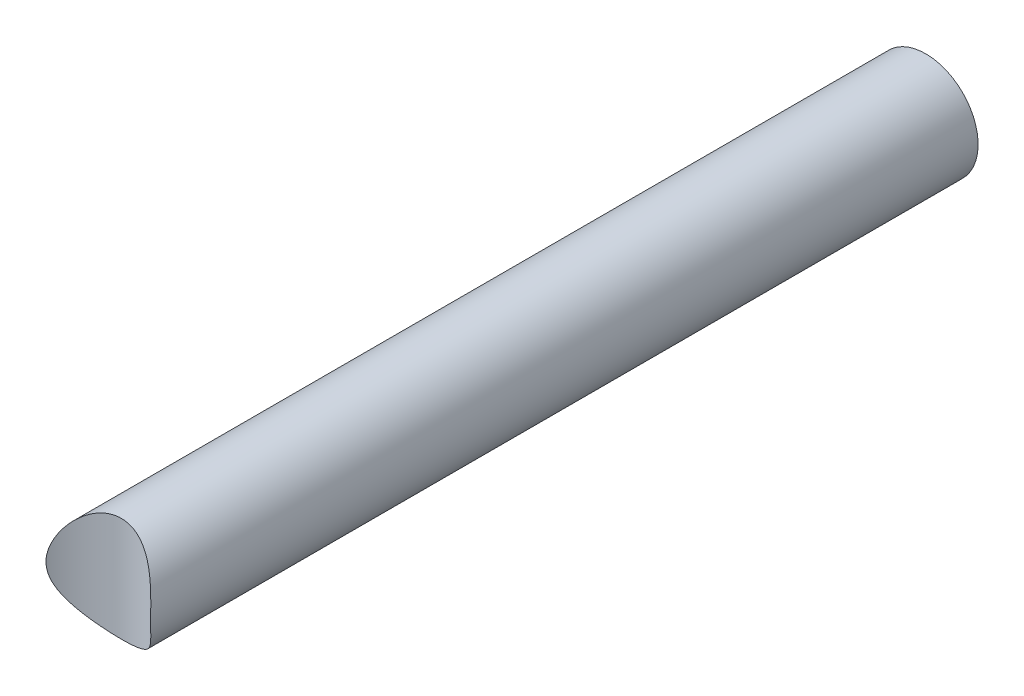
ISO-10303-21;
HEADER;
FILE_DESCRIPTION(('STEP AP214'),'2;1');
FILE_NAME('part.step','',(''),(''),'','','');
FILE_SCHEMA(('AUTOMOTIVE_DESIGN { 1 0 10303 214 1 1 1 1 }'));
ENDSEC;
DATA;
#1=APPLICATION_CONTEXT('core data for automotive mechanical design processes');
#2=APPLICATION_PROTOCOL_DEFINITION('international standard','automotive_design',2000,#1);
#3=PRODUCT_CONTEXT('',#1,'mechanical');
#4=PRODUCT('Part','Part','',(#3));
#5=PRODUCT_RELATED_PRODUCT_CATEGORY('part','',(#4));
#6=PRODUCT_DEFINITION_FORMATION('','',#4);
#7=PRODUCT_DEFINITION_CONTEXT('part definition',#1,'design');
#8=PRODUCT_DEFINITION('design','',#6,#7);
#9=PRODUCT_DEFINITION_SHAPE('','',#8);
#10=(LENGTH_UNIT() NAMED_UNIT(*) SI_UNIT(.MILLI.,.METRE.));
#11=(NAMED_UNIT(*) PLANE_ANGLE_UNIT() SI_UNIT($,.RADIAN.));
#12=(NAMED_UNIT(*) SI_UNIT($,.STERADIAN.) SOLID_ANGLE_UNIT());
#13=UNCERTAINTY_MEASURE_WITH_UNIT(LENGTH_MEASURE(1.E-05),#10,'distance_accuracy_value','');
#14=(GEOMETRIC_REPRESENTATION_CONTEXT(3) GLOBAL_UNCERTAINTY_ASSIGNED_CONTEXT((#13)) GLOBAL_UNIT_ASSIGNED_CONTEXT((#10,
#11,#12)) REPRESENTATION_CONTEXT('',''));
#15=CARTESIAN_POINT('',(0.,0.,0.));
#16=DIRECTION('',(0.,0.,1.));
#17=DIRECTION('',(1.,0.,0.));
#18=AXIS2_PLACEMENT_3D('',#15,#16,#17);
#19=CARTESIAN_POINT('',(120.3546666667,-3.253,-23.91274872028));
#20=DIRECTION('',(0.,1.,0.));
#21=DIRECTION('',(1.,0.,0.));
#22=AXIS2_PLACEMENT_3D('',#19,#20,#21);
#23=CYLINDRICAL_SURFACE('',#22,1.13);
#24=CARTESIAN_POINT('',(121.1846666667,-2.083,-24.6795603007872));
#25=CARTESIAN_POINT('',(121.184663195827,-2.07629415596961,-24.6795639403579));
#26=CARTESIAN_POINT('',(121.184579157766,-2.06958843766594,-24.6796550168079));
#27=CARTESIAN_POINT('',(121.184250240362,-2.05617947401468,-24.6800108666681));
#28=CARTESIAN_POINT('',(121.184005215456,-2.04947623640357,-24.6802757972743));
#29=CARTESIAN_POINT('',(121.18335392635,-2.03607224605109,-24.6809789218308));
#30=CARTESIAN_POINT('',(121.182947316876,-2.02937152958728,-24.6814174867943));
#31=CARTESIAN_POINT('',(121.181972259009,-2.01597254308102,-24.6824668341446));
#32=CARTESIAN_POINT('',(121.181403268736,-2.00927435771238,-24.6830781930954));
#33=CARTESIAN_POINT('',(121.180102488249,-1.99588038314864,-24.6844718674328));
#34=CARTESIAN_POINT('',(121.179369964,-1.98918474557234,-24.68525495334));
#35=CARTESIAN_POINT('',(121.177740838019,-1.97579579597953,-24.6869904996497));
#36=CARTESIAN_POINT('',(121.176843316139,-1.96910271917918,-24.6879439090137));
#37=CARTESIAN_POINT('',(121.174882592162,-1.95571880487038,-24.6900182267966));
#38=CARTESIAN_POINT('',(121.173818291058,-1.94902830057229,-24.6911402441007));
#39=CARTESIAN_POINT('',(121.171522088227,-1.93564943099052,-24.6935495983065));
#40=CARTESIAN_POINT('',(121.170288916934,-1.92896150874953,-24.6948381828988));
#41=CARTESIAN_POINT('',(121.167652739484,-1.91558769181135,-24.6975781867941));
#42=CARTESIAN_POINT('',(121.166248302266,-1.90890235910421,-24.6990309695365));
#43=CARTESIAN_POINT('',(121.163267054887,-1.89553360131803,-24.70209657049));
#44=CARTESIAN_POINT('',(121.161688661796,-1.88885086351406,-24.7037108434545));
#45=CARTESIAN_POINT('',(121.158356657536,-1.87548716983528,-24.7070963141698));
#46=CARTESIAN_POINT('',(121.156601321372,-1.86880703013386,-24.7088690328968));
#47=CARTESIAN_POINT('',(121.15291233105,-1.85544840439695,-24.7125679264293));
#48=CARTESIAN_POINT('',(121.150976820199,-1.84877086447555,-24.7144956626984));
#49=CARTESIAN_POINT('',(121.146923974355,-1.83541730802114,-24.7185008983964));
#50=CARTESIAN_POINT('',(121.144804659273,-1.82874236620449,-24.7205799760456));
#51=CARTESIAN_POINT('',(121.140380921784,-1.81539388348605,-24.7248834195675));
#52=CARTESIAN_POINT('',(121.138074411881,-1.80872154257752,-24.7271093503227));
#53=CARTESIAN_POINT('',(121.130817708816,-1.78856356892677,-24.7340494687466));
#54=CARTESIAN_POINT('',(121.125618236429,-1.77522672352144,-24.7389384777746));
#55=CARTESIAN_POINT('',(121.115117209598,-1.75014464206641,-24.7486083056523));
#56=CARTESIAN_POINT('',(121.109868249722,-1.73836521039926,-24.7533582987735));
#57=CARTESIAN_POINT('',(121.098840226459,-1.71504904941416,-24.7631371265324));
#58=CARTESIAN_POINT('',(121.093057408082,-1.70351487260383,-24.7681678194793));
#59=CARTESIAN_POINT('',(121.08093880931,-1.68069134178225,-24.7784811663147));
#60=CARTESIAN_POINT('',(121.074598230018,-1.6694054258044,-24.7837657836201));
#61=CARTESIAN_POINT('',(121.061344201311,-1.64707674946637,-24.7945540926933));
#62=CARTESIAN_POINT('',(121.054424989779,-1.63603829287032,-24.8000596078131));
#63=CARTESIAN_POINT('',(121.039992474333,-1.61420392143263,-24.8112547228733));
#64=CARTESIAN_POINT('',(121.032472501557,-1.60341317371822,-24.8169457964772));
#65=CARTESIAN_POINT('',(121.016817585294,-1.582073183224,-24.8284735983051));
#66=CARTESIAN_POINT('',(121.00867515252,-1.57152992837739,-24.8343112335683));
#67=CARTESIAN_POINT('',(120.991754141723,-1.55068464370921,-24.8460908534512));
#68=CARTESIAN_POINT('',(120.982967338484,-1.54038937778782,-24.8520329834416));
#69=CARTESIAN_POINT('',(120.964738936018,-1.52003738692253,-24.8639756300422));
#70=CARTESIAN_POINT('',(120.955288511593,-1.50998808876345,-24.8699753237221));
#71=CARTESIAN_POINT('',(120.936106340221,-1.49053870997305,-24.8817439695776));
#72=CARTESIAN_POINT('',(120.926385527891,-1.48112916024993,-24.8875150857017));
#73=CARTESIAN_POINT('',(120.906568807213,-1.4628594816086,-24.8988688539013));
#74=CARTESIAN_POINT('',(120.8964782408,-1.45399442462684,-24.904452884887));
#75=CARTESIAN_POINT('',(120.875923696026,-1.43681142241693,-24.9154079019398));
#76=CARTESIAN_POINT('',(120.865464270061,-1.42848901693844,-24.9207804256147));
#77=CARTESIAN_POINT('',(120.844172951563,-1.41239133558971,-24.9312885387176));
#78=CARTESIAN_POINT('',(120.833344803315,-1.40461214285407,-24.9364257061326));
#79=CARTESIAN_POINT('',(120.811318682393,-1.38960022949405,-24.9464383796099));
#80=CARTESIAN_POINT('',(120.800123624868,-1.38236423873549,-24.9513153898578));
#81=CARTESIAN_POINT('',(120.777367584696,-1.36843788693751,-24.9607826128299));
#82=CARTESIAN_POINT('',(120.765808695887,-1.36174499418082,-24.9653741298036));
#83=CARTESIAN_POINT('',(120.74232984595,-1.34890481826836,-24.9742449346892));
#84=CARTESIAN_POINT('',(120.730411191898,-1.34275581934884,-24.9785251962854));
#85=CARTESIAN_POINT('',(120.706220573162,-1.33099979619503,-24.9867472305013));
#86=CARTESIAN_POINT('',(120.69394918429,-1.32539194727894,-24.9906895171187));
#87=CARTESIAN_POINT('',(120.668560265219,-1.31451510491576,-24.9983608429143));
#88=CARTESIAN_POINT('',(120.655428534329,-1.3092687002281,-25.002075002927));
#89=CARTESIAN_POINT('',(120.628983746825,-1.2994853371425,-25.0090308741204));
#90=CARTESIAN_POINT('',(120.615675218096,-1.29494009604338,-25.012278064375));
#91=CARTESIAN_POINT('',(120.595540205917,-1.28863520857045,-25.0167988871352));
#92=CARTESIAN_POINT('',(120.588828467008,-1.28662647558383,-25.0182421452244));
#93=CARTESIAN_POINT('',(120.575367033154,-1.28278443080786,-25.0210078584121));
#94=CARTESIAN_POINT('',(120.568617686032,-1.28095030664944,-25.0223308715015));
#95=CARTESIAN_POINT('',(120.555083500123,-1.27745743727008,-25.024854954829));
#96=CARTESIAN_POINT('',(120.548298943222,-1.27579796422713,-25.0260565302275));
#97=CARTESIAN_POINT('',(120.534696479002,-1.27265430018016,-25.0283367455091));
#98=CARTESIAN_POINT('',(120.527878794118,-1.27116947141923,-25.0294158321518));
#99=CARTESIAN_POINT('',(120.514212334658,-1.26837500693818,-25.0314500903594));
#100=CARTESIAN_POINT('',(120.507363728271,-1.26706482827446,-25.0324056456588));
#101=CARTESIAN_POINT('',(120.493637686677,-1.26461956685789,-25.0341919110337));
#102=CARTESIAN_POINT('',(120.486760371763,-1.26348404022112,-25.0350229374604));
#103=CARTESIAN_POINT('',(120.472979204341,-1.26138798270277,-25.0365592552412));
#104=CARTESIAN_POINT('',(120.466075431085,-1.26042711058842,-25.0372647917133));
#105=CARTESIAN_POINT('',(120.452243659019,-1.25868025799947,-25.0385492829195));
#106=CARTESIAN_POINT('',(120.445315705829,-1.25789404183631,-25.0391284082197));
#107=CARTESIAN_POINT('',(120.431437907806,-1.25649639569682,-25.0401592731995));
#108=CARTESIAN_POINT('',(120.424488082799,-1.25588483771305,-25.0406111061686));
#109=CARTESIAN_POINT('',(120.410568895564,-1.25483639591687,-25.0413866257935));
#110=CARTESIAN_POINT('',(120.403599535541,-1.25439949312637,-25.0417103263723));
#111=CARTESIAN_POINT('',(120.389643651381,-1.25370026601792,-25.0422288638228));
#112=CARTESIAN_POINT('',(120.382657120221,-1.2534380322866,-25.0424236338283));
#113=CARTESIAN_POINT('',(120.368669288545,-1.25308798239776,-25.0426836362565));
#114=CARTESIAN_POINT('',(120.361667980275,-1.25300036604143,-25.0427487202894));
#115=CARTESIAN_POINT('',(120.347669136344,-1.25299963415636,-25.0427487202706));
#116=CARTESIAN_POINT('',(120.340671600689,-1.25308642436018,-25.0426837065372));
#117=CARTESIAN_POINT('',(120.326690807491,-1.25343499339575,-25.0424239750804));
#118=CARTESIAN_POINT('',(120.319707542685,-1.25369658438603,-25.0422293965884));
#119=CARTESIAN_POINT('',(120.305757681092,-1.2543945946573,-25.0417113441671));
#120=CARTESIAN_POINT('',(120.298791078248,-1.25483093569813,-25.041387927922));
#121=CARTESIAN_POINT('',(120.284876893328,-1.25587834978287,-25.0406130506009));
#122=CARTESIAN_POINT('',(120.277929314913,-1.25648945435171,-25.0401615664232));
#123=CARTESIAN_POINT('',(120.264055497046,-1.25788628193355,-25.0391314443701));
#124=CARTESIAN_POINT('',(120.25712927937,-1.25867214562909,-25.0385527040568));
#125=CARTESIAN_POINT('',(120.243300465387,-1.26041838341663,-25.0372689999709));
#126=CARTESIAN_POINT('',(120.236397917141,-1.26137900592345,-25.036563856541));
#127=CARTESIAN_POINT('',(120.222618687906,-1.26347465382436,-25.0350283139245));
#128=CARTESIAN_POINT('',(120.215742089093,-1.26461003314559,-25.0341976606124));
#129=CARTESIAN_POINT('',(120.202016969988,-1.26705508969237,-25.032412102634));
#130=CARTESIAN_POINT('',(120.195168573376,-1.26836522338672,-25.031456872717));
#131=CARTESIAN_POINT('',(120.181502026982,-1.27115968793576,-25.0294231987481));
#132=CARTESIAN_POINT('',(120.174684049213,-1.27264457413444,-25.0283443621919));
#133=CARTESIAN_POINT('',(120.161080496683,-1.27578844274349,-25.0260645529946));
#134=CARTESIAN_POINT('',(120.15429514859,-1.27744807505361,-25.0248631249736));
#135=CARTESIAN_POINT('',(120.140758883827,-1.28094135497224,-25.0223392153584));
#136=CARTESIAN_POINT('',(120.134008253644,-1.28277574223512,-25.0210162201484));
#137=CARTESIAN_POINT('',(120.120543760123,-1.28661839790289,-25.0182503937054));
#138=CARTESIAN_POINT('',(120.113830249545,-1.28862749009106,-25.0168069962046));
#139=CARTESIAN_POINT('',(120.093688504424,-1.29493384549153,-25.0122853408102));
#140=CARTESIAN_POINT('',(120.080375044206,-1.29948021263197,-25.0090373085182));
#141=CARTESIAN_POINT('',(120.05391840027,-1.30926587886822,-25.0020788454895));
#142=CARTESIAN_POINT('',(120.040779788619,-1.31451353764469,-24.9983628736527));
#143=CARTESIAN_POINT('',(120.015390172309,-1.32538810687565,-24.9906913369078));
#144=CARTESIAN_POINT('',(120.003124606436,-1.33099185058806,-24.9867510328584));
#145=CARTESIAN_POINT('',(119.978943881546,-1.34274097048451,-24.9785328094437));
#146=CARTESIAN_POINT('',(119.967029352898,-1.34888725022211,-24.974254328157));
#147=CARTESIAN_POINT('',(119.943556914145,-1.36172296513964,-24.9653867040128));
#148=CARTESIAN_POINT('',(119.932000370109,-1.36841419410882,-24.9607965441946));
#149=CARTESIAN_POINT('',(119.909247269742,-1.38233828401994,-24.9513314896202));
#150=CARTESIAN_POINT('',(119.898052869868,-1.38957375296,-24.9464552522));
#151=CARTESIAN_POINT('',(119.876026372976,-1.40458567144216,-24.9364434114852));
#152=CARTESIAN_POINT('',(119.865197256137,-1.4123654641289,-24.9313062703966));
#153=CARTESIAN_POINT('',(119.843902373257,-1.42846538799182,-24.9207973350281));
#154=CARTESIAN_POINT('',(119.833440417738,-1.43678950476438,-24.9154239336973));
#155=CARTESIAN_POINT('',(119.812879311225,-1.45397703618036,-24.9044661687316));
#156=CARTESIAN_POINT('',(119.802784779364,-1.46284497533402,-24.8988802428517));
#157=CARTESIAN_POINT('',(119.782958543688,-1.48112129957973,-24.8875214550881));
#158=CARTESIAN_POINT('',(119.773232245964,-1.49053466922642,-24.8817471923373));
#159=CARTESIAN_POINT('',(119.75404913676,-1.50998240056438,-24.8699779709602));
#160=CARTESIAN_POINT('',(119.744602774161,-1.52002581156478,-24.8639809431895));
#161=CARTESIAN_POINT('',(119.726381250998,-1.54036781411141,-24.852043150524));
#162=CARTESIAN_POINT('',(119.717597331515,-1.5506590299276,-24.8461031959127));
#163=CARTESIAN_POINT('',(119.700680730584,-1.57149775534354,-24.83432721205));
#164=CARTESIAN_POINT('',(119.692539896836,-1.58203855941081,-24.8284910362603));
#165=CARTESIAN_POINT('',(119.676886932791,-1.60337524847595,-24.8169653547402));
#166=CARTESIAN_POINT('',(119.66936738825,-1.61416520479381,-24.8112749499089));
#167=CARTESIAN_POINT('',(119.654934539096,-1.63599957885484,-24.8000802728172));
#168=CARTESIAN_POINT('',(119.648014643,-1.64703888958452,-24.7945745442732));
#169=CARTESIAN_POINT('',(119.634758103178,-1.66937085142027,-24.7837848133578));
#170=CARTESIAN_POINT('',(119.62841577613,-1.68065925817869,-24.7784990139505));
#171=CARTESIAN_POINT('',(119.616292650617,-1.70348939288379,-24.768182288959));
#172=CARTESIAN_POINT('',(119.61050713189,-1.71502773974431,-24.763149433805));
#173=CARTESIAN_POINT('',(119.599472519993,-1.7383536997999,-24.7533650205191));
#174=CARTESIAN_POINT('',(119.594219750712,-1.7501388147576,-24.7486116456707));
#175=CARTESIAN_POINT('',(119.583715173845,-1.77522342181963,-24.7389385483517));
#176=CARTESIAN_POINT('',(119.578515552849,-1.78855684958768,-24.7340493988501));
#177=CARTESIAN_POINT('',(119.571258881967,-1.80871026920955,-24.7271093131278));
#178=CARTESIAN_POINT('',(119.56895238654,-1.81538132067322,-24.7248833953665));
#179=CARTESIAN_POINT('',(119.56452865869,-1.82872744741194,-24.7205799608379));
#180=CARTESIAN_POINT('',(119.562409342236,-1.83540132445835,-24.7185008816559));
#181=CARTESIAN_POINT('',(119.558356494365,-1.84875298926731,-24.7144956442104));
#182=CARTESIAN_POINT('',(119.556420986395,-1.85542970403216,-24.7125679104066));
#183=CARTESIAN_POINT('',(119.552731996888,-1.86878691322363,-24.7088690177413));
#184=CARTESIAN_POINT('',(119.55097666258,-1.87546646341105,-24.7070963006142));
#185=CARTESIAN_POINT('',(119.54764465817,-1.88882921277451,-24.7037108298625));
#186=CARTESIAN_POINT('',(119.546066267299,-1.89551159770148,-24.702096558914));
#187=CARTESIAN_POINT('',(119.543085019815,-1.90887988411802,-24.699030957943));
#188=CARTESIAN_POINT('',(119.541680584812,-1.91556510026961,-24.6975781772873));
#189=CARTESIAN_POINT('',(119.539044407038,-1.92893891855426,-24.6948381731426));
#190=CARTESIAN_POINT('',(119.537811238037,-1.93562696058911,-24.6935495907821));
#191=CARTESIAN_POINT('',(119.535515034731,-1.94900630425403,-24.6911402361509));
#192=CARTESIAN_POINT('',(119.534450735955,-1.95569716463361,-24.6900182211773));
#193=CARTESIAN_POINT('',(119.532490011326,-1.96908202571822,-24.6879439027646));
#194=CARTESIAN_POINT('',(119.531592491794,-1.97577569485169,-24.686990495805));
#195=CARTESIAN_POINT('',(119.529963364978,-1.98916606389253,-24.6852549486521));
#196=CARTESIAN_POINT('',(119.529230843066,-1.99586253001992,-24.6844718651832));
#197=CARTESIAN_POINT('',(119.527930061547,-2.00925839667284,-24.6830781897715));
#198=CARTESIAN_POINT('',(119.527361073566,-2.01595764677099,-24.6824668332477));
#199=CARTESIAN_POINT('',(119.526386014455,-2.02935899802241,-24.6814174845765));
#200=CARTESIAN_POINT('',(119.525979407194,-2.03606101541551,-24.6809789219804));
#201=CARTESIAN_POINT('',(119.525328116603,-2.04946784304575,-24.6802757958328));
#202=CARTESIAN_POINT('',(119.52508309378,-2.05617261762077,-24.6800108674772));
#203=CARTESIAN_POINT('',(119.524754174659,-2.06958489150233,-24.6796550157459));
#204=CARTESIAN_POINT('',(119.524670138542,-2.07629238337932,-24.679563941377));
#205=CARTESIAN_POINT('',(119.5246666667,-2.083,-24.6795603007872));
#206=B_SPLINE_CURVE_WITH_KNOTS('',3,(#24,#25,#26,#27,#28,#29,#30,#31,#32,#33,#34,#35,#36,#37,
#38,#39,#40,#41,#42,#43,#44,#45,#46,#47,#48,#49,#50,#51,#52,#53,#54,#55,#56,#57,#58,#59,#60,#61,
#62,#63,#64,#65,#66,#67,#68,#69,#70,#71,#72,#73,#74,#75,#76,#77,#78,#79,#80,#81,#82,#83,#84,#85,
#86,#87,#88,#89,#90,#91,#92,#93,#94,#95,#96,#97,#98,#99,#100,#101,#102,#103,#104,#105,#106,#107,
#108,#109,#110,#111,#112,#113,#114,#115,#116,#117,#118,#119,#120,#121,#122,#123,#124,#125,#126,
#127,#128,#129,#130,#131,#132,#133,#134,#135,#136,#137,#138,#139,#140,#141,#142,#143,#144,#145,
#146,#147,#148,#149,#150,#151,#152,#153,#154,#155,#156,#157,#158,#159,#160,#161,#162,#163,#164,
#165,#166,#167,#168,#169,#170,#171,#172,#173,#174,#175,#176,#177,#178,#179,#180,#181,#182,#183,
#184,#185,#186,#187,#188,#189,#190,#191,#192,#193,#194,#195,#196,#197,#198,#199,#200,#201,#202,
#203,#204,#205),.UNSPECIFIED.,.F.,.F.,(4,2,2,2,2,2,2,2,2,2,2,2,2,2,2,2,2,2,2,2,2,2,2,2,2,2,2,2,
2,2,2,2,2,2,2,2,2,2,2,2,2,2,2,2,2,2,2,2,2,2,2,2,2,2,2,2,2,2,2,2,2,2,2,2,2,2,2,2,2,2,2,2,2,2,2,2,
2,2,2,2,2,2,2,2,2,2,2,2,2,2,4),(0.,0.0201164341544235,0.0402510823576994,0.0604289874882732,
0.0806750318882731,0.101013847788572,0.121469732247295,0.142066567978191,0.162827751211063,
0.183776127460563,0.204933935799402,0.226322761953688,0.247963500276318,0.269876324420341,
0.29208066633595,0.337433354602662,0.378648220767756,0.420179011179961,0.46211069827601,
0.504525842733084,0.547504216618316,0.591122499194026,0.635454046515207,0.680568732541356,
0.724679832810908,0.768302743776456,0.811503978945245,0.854352015387991,0.896917034646315,
0.939270624988156,0.981485450111248,1.0236348911768,1.06747362558842,1.11074654262944,
1.13220294517697,1.15355406875849,1.17481236452391,1.19599044735147,1.21710107591611,
1.23815713151247,1.25917159579066,1.28015752758457,1.30112803903168,1.32209627119803,
1.34307536943278,1.36407845868255,1.38507019873334,1.40603941719461,1.42699925766877,
1.44796288139749,1.46894344250272,1.4899540632945,1.51100780987645,1.53211766827332,
1.55329652129358,1.57455712632476,1.5959120942398,1.61737386957027,1.660662080095,
1.70452208323786,1.74664969133482,1.78884883358931,1.83119297805448,1.87375484211443,
1.91660603497861,1.95981672764371,2.00345535710566,2.04758836979048,2.09268040915524,
2.13699571122974,2.18060421944107,2.22357933141484,2.26599773577973,2.30793917782944,
2.34948615202573,2.39072352274086,2.4360674461982,2.45826826974994,2.48017817591656,
2.50181661536546,2.52320377954972,2.5443605794689,2.56530861610048,2.58607014213173,
2.60666801482072,2.62712564005005,2.64746690789867,2.66771612033564,2.68789791191904,
2.7080371646483,2.72815891835066),.UNSPECIFIED.);
#207=CARTESIAN_POINT('',(121.1846666667,-2.083,-24.67956030079));
#208=VERTEX_POINT('',#207);
#209=CARTESIAN_POINT('',(119.5246666667,-2.083,-24.6795603007872));
#210=VERTEX_POINT('',#209);
#211=EDGE_CURVE('E54',#208,#210,#206,.T.);
#212=ORIENTED_EDGE('',*,*,#211,.T.);
#213=CARTESIAN_POINT('',(119.5246666667,-2.083,-24.6795603007872));
#214=CARTESIAN_POINT('',(119.524670137574,-2.08970584402991,-24.679563940358));
#215=CARTESIAN_POINT('',(119.524754175634,-2.09641156233309,-24.6796550168081));
#216=CARTESIAN_POINT('',(119.525083093038,-2.10982052598344,-24.6800108666684));
#217=CARTESIAN_POINT('',(119.525328117944,-2.11652376359413,-24.6802757972746));
#218=CARTESIAN_POINT('',(119.525979407051,-2.12992775394584,-24.6809789218313));
#219=CARTESIAN_POINT('',(119.526386016525,-2.13662847040929,-24.6814174867948));
#220=CARTESIAN_POINT('',(119.527361074391,-2.1500274569149,-24.6824668341452));
#221=CARTESIAN_POINT('',(119.527930064665,-2.15672564228325,-24.6830781930961));
#222=CARTESIAN_POINT('',(119.529230845152,-2.17011961684647,-24.6844718674336));
#223=CARTESIAN_POINT('',(119.529963369401,-2.17681525442254,-24.6852549533408));
#224=CARTESIAN_POINT('',(119.531592495382,-2.19020420401497,-24.6869904996506));
#225=CARTESIAN_POINT('',(119.532490017262,-2.19689728081515,-24.6879439090146));
#226=CARTESIAN_POINT('',(119.534450741239,-2.2102811951237,-24.6900182267975));
#227=CARTESIAN_POINT('',(119.535515042343,-2.21697169942168,-24.6911402441017));
#228=CARTESIAN_POINT('',(119.537811245174,-2.23035056900333,-24.6935495983075));
#229=CARTESIAN_POINT('',(119.539044416467,-2.23703849124429,-24.6948381828998));
#230=CARTESIAN_POINT('',(119.541680593917,-2.25041230818247,-24.6975781867951));
#231=CARTESIAN_POINT('',(119.543085031134,-2.25709764088964,-24.6990309695375));
#232=CARTESIAN_POINT('',(119.546066278514,-2.27046639867595,-24.702096570491));
#233=CARTESIAN_POINT('',(119.547644671605,-2.27714913648001,-24.7037108434554));
#234=CARTESIAN_POINT('',(119.550976675865,-2.29051283015905,-24.7070963141707));
#235=CARTESIAN_POINT('',(119.552732012028,-2.29719296986064,-24.7088690328977));
#236=CARTESIAN_POINT('',(119.556421002351,-2.31055159559794,-24.7125679264301));
#237=CARTESIAN_POINT('',(119.558356513202,-2.31722913551956,-24.7144956626992));
#238=CARTESIAN_POINT('',(119.562409359046,-2.33058269197448,-24.7185008983971));
#239=CARTESIAN_POINT('',(119.564528674128,-2.33725763379143,-24.7205799760462));
#240=CARTESIAN_POINT('',(119.568952411617,-2.35060611651051,-24.7248834195681));
#241=CARTESIAN_POINT('',(119.571258921519,-2.35727845741939,-24.7271093503232));
#242=CARTESIAN_POINT('',(119.578515624585,-2.3774364310714,-24.7340494687469));
#243=CARTESIAN_POINT('',(119.583715096971,-2.39077327647772,-24.7389384777746));
#244=CARTESIAN_POINT('',(119.594216123798,-2.4158553579251,-24.7486083056487));
#245=CARTESIAN_POINT('',(119.59946508367,-2.42763478958386,-24.7533582987662));
#246=CARTESIAN_POINT('',(119.610493106926,-2.45095095055458,-24.7631371265191));
#247=CARTESIAN_POINT('',(119.616275925299,-2.46248512735883,-24.7681678194635));
#248=CARTESIAN_POINT('',(119.628394524066,-2.48530865817076,-24.7784811662953));
#249=CARTESIAN_POINT('',(119.634735103357,-2.49659457414497,-24.7837657835994));
#250=CARTESIAN_POINT('',(119.647989132061,-2.51892325047818,-24.794554092671));
#251=CARTESIAN_POINT('',(119.654908343593,-2.52996170707298,-24.8000596077906));
#252=CARTESIAN_POINT('',(119.669340859038,-2.55179607851066,-24.8112547228512));
#253=CARTESIAN_POINT('',(119.676860831815,-2.56258682622624,-24.8169457964559));
#254=CARTESIAN_POINT('',(119.69251574808,-2.58392681672527,-24.8284735982861));
#255=CARTESIAN_POINT('',(119.700658180856,-2.59447007157547,-24.8343112335509));
#256=CARTESIAN_POINT('',(119.717579191657,-2.61531535625322,-24.8460908534378));
#257=CARTESIAN_POINT('',(119.7263659949,-2.62561062218053,-24.8520329834306));
#258=CARTESIAN_POINT('',(119.744594397372,-2.64596261306043,-24.8639756300364));
#259=CARTESIAN_POINT('',(119.754044821802,-2.65601191122812,-24.8699753237192));
#260=CARTESIAN_POINT('',(119.773226993173,-2.67546129002509,-24.8817439695743));
#261=CARTESIAN_POINT('',(119.782947805498,-2.68487083974661,-24.8875150856952));
#262=CARTESIAN_POINT('',(119.802764526166,-2.70314051838501,-24.8988688538897));
#263=CARTESIAN_POINT('',(119.812855092575,-2.71200557536539,-24.9044528848734));
#264=CARTESIAN_POINT('',(119.833409637342,-2.7291885775732,-24.9154079019235));
#265=CARTESIAN_POINT('',(119.843869063305,-2.7375109830509,-24.9207804255975));
#266=CARTESIAN_POINT('',(119.8651603818,-2.75360866439862,-24.9312885386996));
#267=CARTESIAN_POINT('',(119.875988530046,-2.76138785713397,-24.9364257061146));
#268=CARTESIAN_POINT('',(119.898014650968,-2.776399770494,-24.9464383795927));
#269=CARTESIAN_POINT('',(119.909209708494,-2.78363576125279,-24.9513153898415));
#270=CARTESIAN_POINT('',(119.931965748669,-2.79756211305181,-24.9607826128158));
#271=CARTESIAN_POINT('',(119.94352463748,-2.80425500580925,-24.9653741297908));
#272=CARTESIAN_POINT('',(119.967003487424,-2.81709518172378,-24.9742449346796));
#273=CARTESIAN_POINT('',(119.97892214148,-2.82324418064456,-24.9785251962777));
#274=CARTESIAN_POINT('',(120.003112760226,-2.83500020380148,-24.9867472304975));
#275=CARTESIAN_POINT('',(120.015384149104,-2.84060805271936,-24.9906895171169));
#276=CARTESIAN_POINT('',(120.040773068183,-2.85148489508433,-24.998360842915));
#277=CARTESIAN_POINT('',(120.053904799075,-2.85673129977217,-25.0020750029283));
#278=CARTESIAN_POINT('',(120.080349586584,-2.86651466285806,-25.0090308741226));
#279=CARTESIAN_POINT('',(120.093658115314,-2.87105990395732,-25.0122780643775));
#280=CARTESIAN_POINT('',(120.113793127495,-2.87736479143047,-25.0167988871379));
#281=CARTESIAN_POINT('',(120.120504866405,-2.87937352441714,-25.0182421452272));
#282=CARTESIAN_POINT('',(120.13396630026,-2.88321556919318,-25.021007858415));
#283=CARTESIAN_POINT('',(120.140715647383,-2.88504969335163,-25.0223308715044));
#284=CARTESIAN_POINT('',(120.154249833292,-2.88854256273104,-25.0248549548318));
#285=CARTESIAN_POINT('',(120.161034390194,-2.89020203577402,-25.0260565302302));
#286=CARTESIAN_POINT('',(120.174636854414,-2.89334569982101,-25.0283367455117));
#287=CARTESIAN_POINT('',(120.181454539298,-2.89483052858194,-25.0294158321543));
#288=CARTESIAN_POINT('',(120.195120998758,-2.89762499306299,-25.0314500903617));
#289=CARTESIAN_POINT('',(120.201969605145,-2.89893517172671,-25.032405645661));
#290=CARTESIAN_POINT('',(120.215695646739,-2.90138043314326,-25.0341919110357));
#291=CARTESIAN_POINT('',(120.222572961652,-2.90251595978001,-25.0350229374622));
#292=CARTESIAN_POINT('',(120.236354129074,-2.90461201729831,-25.0365592552428));
#293=CARTESIAN_POINT('',(120.24325790233,-2.90557288941263,-25.0372647917148));
#294=CARTESIAN_POINT('',(120.257089674395,-2.90731974200151,-25.0385492829206));
#295=CARTESIAN_POINT('',(120.264017627584,-2.90810595816462,-25.0391284082208));
#296=CARTESIAN_POINT('',(120.277895425606,-2.90950360430402,-25.0401592732003));
#297=CARTESIAN_POINT('',(120.284845250612,-2.91011516228773,-25.0406111061692));
#298=CARTESIAN_POINT('',(120.298764437845,-2.91116360408379,-25.041386625794));
#299=CARTESIAN_POINT('',(120.305733797867,-2.91160050687422,-25.0417103263727));
#300=CARTESIAN_POINT('',(120.319689682025,-2.91229973398253,-25.042228863823));
#301=CARTESIAN_POINT('',(120.326676213184,-2.91256196771376,-25.0424236338285));
#302=CARTESIAN_POINT('',(120.340664044858,-2.91291201760243,-25.0426836362565));
#303=CARTESIAN_POINT('',(120.347665353126,-2.91299963395867,-25.0427487202894));
#304=CARTESIAN_POINT('',(120.361664197054,-2.91300036584354,-25.0427487202706));
#305=CARTESIAN_POINT('',(120.368661732707,-2.91291357563962,-25.0426837065373));
#306=CARTESIAN_POINT('',(120.382642525902,-2.91256500660388,-25.0424239750806));
#307=CARTESIAN_POINT('',(120.389625790706,-2.91230341561351,-25.0422293965887));
#308=CARTESIAN_POINT('',(120.403575652296,-2.9116054053421,-25.0417113441676));
#309=CARTESIAN_POINT('',(120.410542255138,-2.91116906430119,-25.0413879279227));
#310=CARTESIAN_POINT('',(120.424456440056,-2.91012165021633,-25.0406130506019));
#311=CARTESIAN_POINT('',(120.43140401847,-2.90951054564743,-25.0401615664243));
#312=CARTESIAN_POINT('',(120.445277836335,-2.90811371806549,-25.0391314443717));
#313=CARTESIAN_POINT('',(120.452204054009,-2.90732785436991,-25.0385527040585));
#314=CARTESIAN_POINT('',(120.466032867991,-2.90558161658229,-25.0372689999731));
#315=CARTESIAN_POINT('',(120.472935416237,-2.90462099407543,-25.0365638565434));
#316=CARTESIAN_POINT('',(120.48671464547,-2.90252534617448,-25.0350283139273));
#317=CARTESIAN_POINT('',(120.493591244283,-2.90138996685322,-25.0341976606153));
#318=CARTESIAN_POINT('',(120.507316363387,-2.89894491030642,-25.0324121026373));
#319=CARTESIAN_POINT('',(120.514164759999,-2.89763477661206,-25.0314568727205));
#320=CARTESIAN_POINT('',(120.527831306394,-2.89484031206302,-25.0294231987519));
#321=CARTESIAN_POINT('',(120.534649284163,-2.89335542586434,-25.0283443621958));
#322=CARTESIAN_POINT('',(120.548252836693,-2.89021155725532,-25.0260645529987));
#323=CARTESIAN_POINT('',(120.555038184787,-2.88855192494522,-25.0248631249778));
#324=CARTESIAN_POINT('',(120.568574449551,-2.88505864502664,-25.0223392153627));
#325=CARTESIAN_POINT('',(120.575325079735,-2.88322425776378,-25.0210162201527));
#326=CARTESIAN_POINT('',(120.588789573257,-2.87938160209609,-25.0182503937096));
#327=CARTESIAN_POINT('',(120.595503083836,-2.87737250990796,-25.0168069962087));
#328=CARTESIAN_POINT('',(120.61564482896,-2.87106615450753,-25.012285340814));
#329=CARTESIAN_POINT('',(120.62895828918,-2.86651978736714,-25.0090373085215));
#330=CARTESIAN_POINT('',(120.655414933123,-2.85673412113134,-25.0020788454915));
#331=CARTESIAN_POINT('',(120.668553544778,-2.85148646235522,-24.9983628736538));
#332=CARTESIAN_POINT('',(120.693943161084,-2.84061189312886,-24.9906913369099));
#333=CARTESIAN_POINT('',(120.70620872695,-2.83500814942117,-24.9867510328629));
#334=CARTESIAN_POINT('',(120.730389451828,-2.82325902953268,-24.9785328094527));
#335=CARTESIAN_POINT('',(120.742303980472,-2.81711274979824,-24.974254328168));
#336=CARTESIAN_POINT('',(120.765776419217,-2.8042770348859,-24.9653867040275));
#337=CARTESIAN_POINT('',(120.77733296325,-2.79758580591864,-24.9607965442109));
#338=CARTESIAN_POINT('',(120.800086063614,-2.78366171601014,-24.9513314896391));
#339=CARTESIAN_POINT('',(120.811280463487,-2.77642624707069,-24.9464552522198));
#340=CARTESIAN_POINT('',(120.833306960379,-2.76141432858853,-24.936443411506));
#341=CARTESIAN_POINT('',(120.84413607722,-2.75363453590109,-24.9313062704174));
#342=CARTESIAN_POINT('',(120.865430960104,-2.73753461203557,-24.920797335048));
#343=CARTESIAN_POINT('',(120.875892915626,-2.72921049526102,-24.9154239337161));
#344=CARTESIAN_POINT('',(120.896454022146,-2.71202296383979,-24.9044661687472));
#345=CARTESIAN_POINT('',(120.906548554012,-2.7031550246828,-24.8988802428651));
#346=CARTESIAN_POINT('',(120.926374789699,-2.68487870042937,-24.8875214550956));
#347=CARTESIAN_POINT('',(120.93610108743,-2.67546533077823,-24.8817471923411));
#348=CARTESIAN_POINT('',(120.955284196637,-2.6560175994396,-24.8699779709616));
#349=CARTESIAN_POINT('',(120.964730559234,-2.64597418844334,-24.8639809431922));
#350=CARTESIAN_POINT('',(120.982952082394,-2.62563218590371,-24.8520431505292));
#351=CARTESIAN_POINT('',(120.991736001876,-2.61534097009034,-24.8461031959191));
#352=CARTESIAN_POINT('',(121.008652602804,-2.59450224467896,-24.8343272120582));
#353=CARTESIAN_POINT('',(121.016793436552,-2.5839614406134,-24.8284910362694));
#354=CARTESIAN_POINT('',(121.032446400596,-2.56262475155056,-24.8169653547504));
#355=CARTESIAN_POINT('',(121.039965945136,-2.55183479523325,-24.8112749499194));
#356=CARTESIAN_POINT('',(121.05439879429,-2.53000042117222,-24.800080272828));
#357=CARTESIAN_POINT('',(121.061318690387,-2.51896111044194,-24.7945745442838));
#358=CARTESIAN_POINT('',(121.07457523021,-2.49662914860389,-24.7837848133676));
#359=CARTESIAN_POINT('',(121.080917557259,-2.48534074184374,-24.7784990139597));
#360=CARTESIAN_POINT('',(121.093040682774,-2.46251060713403,-24.7681822889665));
#361=CARTESIAN_POINT('',(121.098826201502,-2.45097226027061,-24.7631494338113));
#362=CARTESIAN_POINT('',(121.109860813403,-2.42764630020816,-24.7533650205226));
#363=CARTESIAN_POINT('',(121.115113582686,-2.41586118524646,-24.7486116456724));
#364=CARTESIAN_POINT('',(121.125618159555,-2.39077657818106,-24.7389385483518));
#365=CARTESIAN_POINT('',(121.130817780551,-2.37744315041377,-24.7340493988502));
#366=CARTESIAN_POINT('',(121.138074451433,-2.3572897307929,-24.727109313128));
#367=CARTESIAN_POINT('',(121.140380946859,-2.3506186793295,-24.7248833953667));
#368=CARTESIAN_POINT('',(121.14480467471,-2.3372725525913,-24.7205799608381));
#369=CARTESIAN_POINT('',(121.146923991164,-2.33059867554511,-24.7185008816562));
#370=CARTESIAN_POINT('',(121.150976839034,-2.31724701073657,-24.7144956442107));
#371=CARTESIAN_POINT('',(121.152912347005,-2.31057029597189,-24.7125679104069));
#372=CARTESIAN_POINT('',(121.156601336511,-2.29721308678074,-24.7088690177416));
#373=CARTESIAN_POINT('',(121.15835667082,-2.29053353659344,-24.7070963006145));
#374=CARTESIAN_POINT('',(121.16168867523,-2.27717078723019,-24.7037108298628));
#375=CARTESIAN_POINT('',(121.1632670661,-2.27048840230329,-24.7020965589143));
#376=CARTESIAN_POINT('',(121.166248313584,-2.25712011588685,-24.6990309579433));
#377=CARTESIAN_POINT('',(121.167652748588,-2.25043489973529,-24.6975781772877));
#378=CARTESIAN_POINT('',(121.170288926362,-2.23706108145064,-24.6948381731429));
#379=CARTESIAN_POINT('',(121.171522095363,-2.23037303941576,-24.6935495907825));
#380=CARTESIAN_POINT('',(121.173818298669,-2.21699369575074,-24.6911402361513));
#381=CARTESIAN_POINT('',(121.174882597444,-2.21030283537108,-24.6900182211777));
#382=CARTESIAN_POINT('',(121.176843322074,-2.19691797428627,-24.6879439027649));
#383=CARTESIAN_POINT('',(121.177740841606,-2.19022430515267,-24.6869904958053));
#384=CARTESIAN_POINT('',(121.179369968422,-2.17683393611152,-24.6852549486524));
#385=CARTESIAN_POINT('',(121.180102490334,-2.17013746998395,-24.6844718651835));
#386=CARTESIAN_POINT('',(121.181403271853,-2.15674160333062,-24.6830781897717));
#387=CARTESIAN_POINT('',(121.181972259834,-2.15004235323224,-24.6824668332479));
#388=CARTESIAN_POINT('',(121.182947318944,-2.13664100198031,-24.6814174845767));
#389=CARTESIAN_POINT('',(121.183353926206,-2.12993898458692,-24.6809789219806));
#390=CARTESIAN_POINT('',(121.184005216796,-2.11653215695607,-24.6802757958329));
#391=CARTESIAN_POINT('',(121.184250239619,-2.10982738238072,-24.6800108674773));
#392=CARTESIAN_POINT('',(121.184579158741,-2.09641510849844,-24.679655015746));
#393=CARTESIAN_POINT('',(121.184663194858,-2.08970761662106,-24.679563941377));
#394=CARTESIAN_POINT('',(121.1846666667,-2.083,-24.6795603007872));
#395=B_SPLINE_CURVE_WITH_KNOTS('',3,(#213,#214,#215,#216,#217,#218,#219,#220,#221,#222,#223,
#224,#225,#226,#227,#228,#229,#230,#231,#232,#233,#234,#235,#236,#237,#238,#239,#240,#241,#242,
#243,#244,#245,#246,#247,#248,#249,#250,#251,#252,#253,#254,#255,#256,#257,#258,#259,#260,#261,
#262,#263,#264,#265,#266,#267,#268,#269,#270,#271,#272,#273,#274,#275,#276,#277,#278,#279,#280,
#281,#282,#283,#284,#285,#286,#287,#288,#289,#290,#291,#292,#293,#294,#295,#296,#297,#298,#299,
#300,#301,#302,#303,#304,#305,#306,#307,#308,#309,#310,#311,#312,#313,#314,#315,#316,#317,#318,
#319,#320,#321,#322,#323,#324,#325,#326,#327,#328,#329,#330,#331,#332,#333,#334,#335,#336,#337,
#338,#339,#340,#341,#342,#343,#344,#345,#346,#347,#348,#349,#350,#351,#352,#353,#354,#355,#356,
#357,#358,#359,#360,#361,#362,#363,#364,#365,#366,#367,#368,#369,#370,#371,#372,#373,#374,#375,
#376,#377,#378,#379,#380,#381,#382,#383,#384,#385,#386,#387,#388,#389,#390,#391,#392,#393,#394),
.UNSPECIFIED.,.F.,.F.,(4,2,2,2,2,2,2,2,2,2,2,2,2,2,2,2,2,2,2,2,2,2,2,2,2,2,2,2,2,2,2,2,2,2,2,2,
2,2,2,2,2,2,2,2,2,2,2,2,2,2,2,2,2,2,2,2,2,2,2,2,2,2,2,2,2,2,2,2,2,2,2,2,2,2,2,2,2,2,2,2,2,2,2,2,
2,2,2,2,2,2,4),(0.,0.0201164341529735,0.0402510823550045,0.0604289874845357,0.0806750318836919,
0.101013847783345,0.121469732241613,0.142066567972239,0.162827751205023,0.183776127454612,
0.204933935793707,0.226322761948411,0.247963500271615,0.269876324416356,0.29208066633283,
0.337433354601655,0.378648220736667,0.420179011127372,0.462110698210543,0.504525842663337,
0.547504216552817,0.591122499141204,0.635454046483325,0.680568732538514,0.724679832790053,
0.768302743742536,0.811503978903362,0.854352015343419,0.896917034604457,0.939270624954542,
0.981485450091479,1.02363489117653,1.06747362559504,1.11074654264105,1.13220294519033,
1.15355406877312,1.17481236453931,1.19599044736712,1.2171010759315,1.2381571315271,
1.259171595804,1.28015752759612,1.30112803904092,1.32209627120445,1.34307536943584,
1.36407845868177,1.38507019872678,1.40603941718304,1.42699925765297,1.44796288137825,
1.46894344248081,1.48995406327068,1.51100780985149,1.53211766824799,1.55329652126863,
1.57455712630092,1.5959120942178,1.61737386955083,1.66066208008275,1.70452208323553,
1.74664969130694,1.78884883354308,1.83119297799719,1.87375484205346,1.91660603492133,
1.95981672759748,2.0034553570778,2.04758836978822,2.09268040913915,2.13699571120366,
2.18060421940895,2.22357933138069,2.26599773574762,2.30793917780347,2.34948615201002,
2.39072352273948,2.43606744619482,2.45826826974576,2.48017817591171,2.50181661536009,
2.52320377954398,2.54436057946293,2.56530861609444,2.58607014212576,2.60666801481499,
2.6271256400447,2.64746690789387,2.66771612033152,2.68789791191577,2.70803716464604,
2.72815891834956),.UNSPECIFIED.);
#396=EDGE_CURVE('E30',#210,#208,#395,.T.);
#397=ORIENTED_EDGE('',*,*,#396,.T.);
#398=EDGE_LOOP('',(#212,#397));
#399=FACE_BOUND('',#398,.T.);
#400=ADVANCED_FACE('F17',(#399),#23,.F.);
#401=CARTESIAN_POINT('',(120.3546666667,-2.083,-29.85637436014));
#402=DIRECTION('',(0.,0.,1.));
#403=DIRECTION('',(1.,0.,0.));
#404=AXIS2_PLACEMENT_3D('',#401,#402,#403);
#405=CYLINDRICAL_SURFACE('',#404,0.83);
#406=ORIENTED_EDGE('',*,*,#211,.F.);
#407=ORIENTED_EDGE('',*,*,#396,.F.);
#408=DIRECTION('',(0.,0.,-1.));
#409=VECTOR('',#408,1.);
#410=CARTESIAN_POINT('',(119.5246666667,-2.083,-29.85637436014));
#411=LINE('',#410,#409);
#412=CARTESIAN_POINT('',(119.5246666667,-2.083,-37.8));
#413=VERTEX_POINT('',#412);
#414=EDGE_CURVE('E11',#210,#413,#411,.T.);
#415=ORIENTED_EDGE('',*,*,#414,.T.);
#416=CARTESIAN_POINT('',(120.3546666667,-2.083,-37.8));
#417=DIRECTION('',(0.,0.,-1.));
#418=DIRECTION('',(1.,0.,0.));
#419=AXIS2_PLACEMENT_3D('',#416,#417,#418);
#420=CIRCLE('',#419,0.83);
#421=EDGE_CURVE('E48',#413,#413,#420,.T.);
#422=ORIENTED_EDGE('',*,*,#421,.F.);
#423=ORIENTED_EDGE('',*,*,#414,.F.);
#424=EDGE_LOOP('',(#406,#407,#415,#422,#423));
#425=FACE_BOUND('',#424,.T.);
#426=ADVANCED_FACE('F19',(#425),#405,.T.);
#427=CARTESIAN_POINT('',(120.3546666667,-2.083,-37.8));
#428=DIRECTION('',(0.,0.,-1.));
#429=DIRECTION('',(0.,-1.,0.));
#430=AXIS2_PLACEMENT_3D('',#427,#428,#429);
#431=PLANE('',#430);
#432=ORIENTED_EDGE('',*,*,#421,.T.);
#433=EDGE_LOOP('',(#432));
#434=FACE_BOUND('',#433,.T.);
#435=ADVANCED_FACE('F52',(#434),#431,.T.);
#436=CLOSED_SHELL('',(#400,#426,#435));
#437=MANIFOLD_SOLID_BREP('B1',#436);
#438=ADVANCED_BREP_SHAPE_REPRESENTATION('',(#18,#437),#14);
#439=SHAPE_DEFINITION_REPRESENTATION(#9,#438);
ENDSEC;
END-ISO-10303-21;
